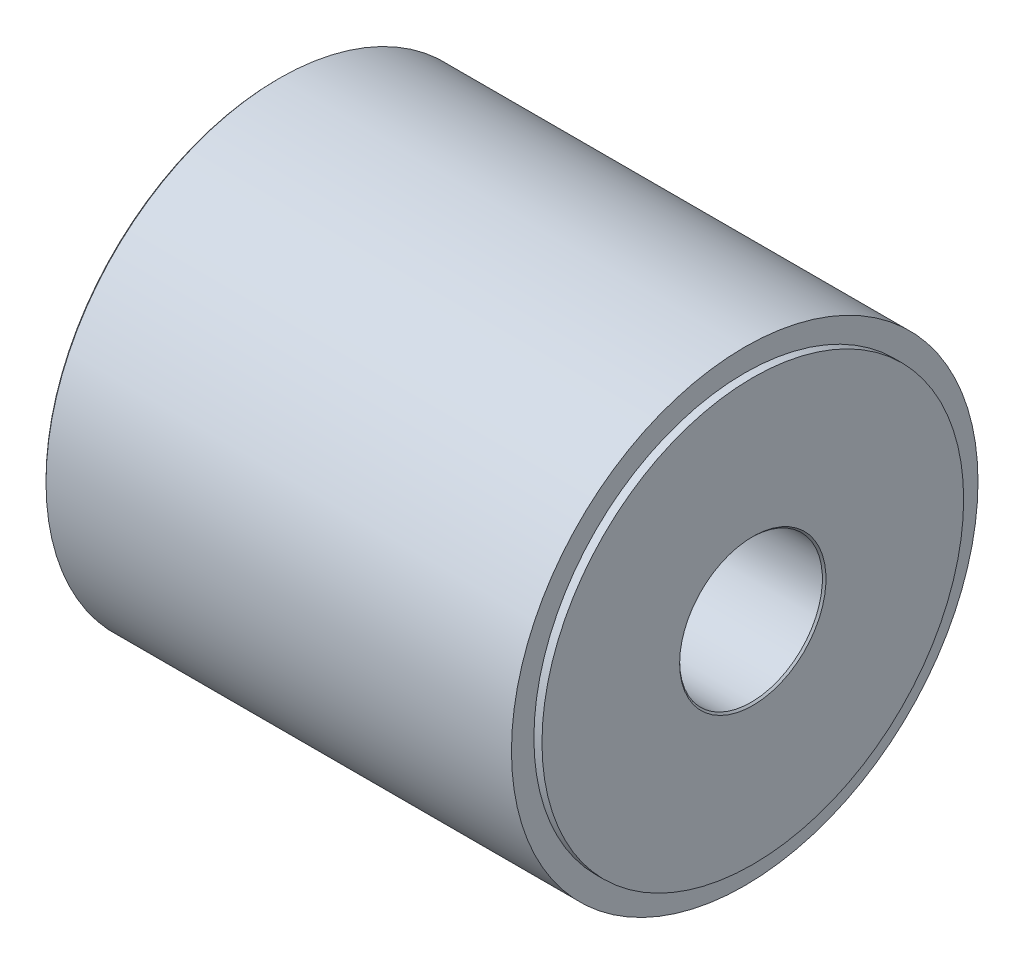
ISO-10303-21;
HEADER;
FILE_DESCRIPTION(('STEP AP214'),'2;1');
FILE_NAME('part.step','',(''),(''),'','','');
FILE_SCHEMA(('AUTOMOTIVE_DESIGN { 1 0 10303 214 1 1 1 1 }'));
ENDSEC;
DATA;
#1=APPLICATION_CONTEXT('core data for automotive mechanical design processes');
#2=APPLICATION_PROTOCOL_DEFINITION('international standard','automotive_design',2000,#1);
#3=PRODUCT_CONTEXT('',#1,'mechanical');
#4=PRODUCT('Part','Part','',(#3));
#5=PRODUCT_RELATED_PRODUCT_CATEGORY('part','',(#4));
#6=PRODUCT_DEFINITION_FORMATION('','',#4);
#7=PRODUCT_DEFINITION_CONTEXT('part definition',#1,'design');
#8=PRODUCT_DEFINITION('design','',#6,#7);
#9=PRODUCT_DEFINITION_SHAPE('','',#8);
#10=(LENGTH_UNIT() NAMED_UNIT(*) SI_UNIT(.MILLI.,.METRE.));
#11=(NAMED_UNIT(*) PLANE_ANGLE_UNIT() SI_UNIT($,.RADIAN.));
#12=(NAMED_UNIT(*) SI_UNIT($,.STERADIAN.) SOLID_ANGLE_UNIT());
#13=UNCERTAINTY_MEASURE_WITH_UNIT(LENGTH_MEASURE(1.E-05),#10,'distance_accuracy_value','');
#14=(GEOMETRIC_REPRESENTATION_CONTEXT(3) GLOBAL_UNCERTAINTY_ASSIGNED_CONTEXT((#13)) GLOBAL_UNIT_ASSIGNED_CONTEXT((#10,
#11,#12)) REPRESENTATION_CONTEXT('',''));
#15=CARTESIAN_POINT('',(0.,0.,0.));
#16=DIRECTION('',(0.,0.,1.));
#17=DIRECTION('',(1.,0.,0.));
#18=AXIS2_PLACEMENT_3D('',#15,#16,#17);
#19=CARTESIAN_POINT('',(0.,7.9565,0.));
#20=DIRECTION('',(1.,0.,0.));
#21=DIRECTION('',(0.,0.,-1.));
#22=AXIS2_PLACEMENT_3D('',#19,#20,#21);
#23=PLANE('',#22);
#24=CARTESIAN_POINT('',(0.,0.,0.));
#25=DIRECTION('',(1.,0.,0.));
#26=DIRECTION('',(0.,0.,-1.));
#27=AXIS2_PLACEMENT_3D('',#24,#25,#26);
#28=CIRCLE('',#27,23.3);
#29=CARTESIAN_POINT('',(0.,0.,-23.3));
#30=VERTEX_POINT('',#29);
#31=EDGE_CURVE('E54',#30,#30,#28,.F.);
#32=ORIENTED_EDGE('',*,*,#31,.T.);
#33=EDGE_LOOP('',(#32));
#34=FACE_BOUND('',#33,.T.);
#35=CARTESIAN_POINT('',(0.,0.,0.));
#36=DIRECTION('',(1.,0.,0.));
#37=DIRECTION('',(0.,0.,-1.));
#38=AXIS2_PLACEMENT_3D('',#35,#36,#37);
#39=CIRCLE('',#38,8.15650000000001);
#40=CARTESIAN_POINT('',(0.,0.,-8.15650000000001));
#41=VERTEX_POINT('',#40);
#42=EDGE_CURVE('E57',#41,#41,#39,.T.);
#43=ORIENTED_EDGE('',*,*,#42,.T.);
#44=EDGE_LOOP('',(#43));
#45=FACE_BOUND('',#44,.T.);
#46=ADVANCED_FACE('F34',(#34,#45),#23,.F.);
#47=CARTESIAN_POINT('',(0.,0.,0.));
#48=DIRECTION('',(-1.,0.,0.));
#49=DIRECTION('',(0.,0.,1.));
#50=AXIS2_PLACEMENT_3D('',#47,#48,#49);
#51=CYLINDRICAL_SURFACE('',#50,23.5);
#52=CARTESIAN_POINT('',(0.200000000000013,0.,0.));
#53=DIRECTION('',(1.,0.,0.));
#54=DIRECTION('',(0.,0.,-1.));
#55=AXIS2_PLACEMENT_3D('',#52,#53,#54);
#56=CIRCLE('',#55,23.5);
#57=CARTESIAN_POINT('',(0.200000000000013,0.,-23.5));
#58=VERTEX_POINT('',#57);
#59=EDGE_CURVE('E49',#58,#58,#56,.T.);
#60=ORIENTED_EDGE('',*,*,#59,.T.);
#61=EDGE_LOOP('',(#60));
#62=FACE_BOUND('',#61,.T.);
#63=CARTESIAN_POINT('',(1.,0.,0.));
#64=DIRECTION('',(-1.,0.,0.));
#65=DIRECTION('',(0.,0.,1.));
#66=AXIS2_PLACEMENT_3D('',#63,#64,#65);
#67=CIRCLE('',#66,23.5);
#68=CARTESIAN_POINT('',(1.,0.,23.5));
#69=VERTEX_POINT('',#68);
#70=EDGE_CURVE('E66',#69,#69,#67,.T.);
#71=ORIENTED_EDGE('',*,*,#70,.T.);
#72=EDGE_LOOP('',(#71));
#73=FACE_BOUND('',#72,.T.);
#74=ADVANCED_FACE('F96',(#62,#73),#51,.T.);
#75=CARTESIAN_POINT('',(1.,23.5,0.));
#76=DIRECTION('',(1.,0.,0.));
#77=DIRECTION('',(0.,0.,-1.));
#78=AXIS2_PLACEMENT_3D('',#75,#76,#77);
#79=PLANE('',#78);
#80=CARTESIAN_POINT('',(1.,0.,0.));
#81=DIRECTION('',(1.,0.,0.));
#82=DIRECTION('',(0.,0.,-1.));
#83=AXIS2_PLACEMENT_3D('',#80,#81,#82);
#84=CIRCLE('',#83,25.8);
#85=CARTESIAN_POINT('',(1.,0.,-25.8));
#86=VERTEX_POINT('',#85);
#87=EDGE_CURVE('E63',#86,#86,#84,.F.);
#88=ORIENTED_EDGE('',*,*,#87,.T.);
#89=EDGE_LOOP('',(#88));
#90=FACE_BOUND('',#89,.T.);
#91=ORIENTED_EDGE('',*,*,#70,.F.);
#92=EDGE_LOOP('',(#91));
#93=FACE_BOUND('',#92,.T.);
#94=ADVANCED_FACE('F102',(#90,#93),#79,.F.);
#95=CARTESIAN_POINT('',(0.,0.,0.));
#96=DIRECTION('',(-1.,0.,0.));
#97=DIRECTION('',(0.,0.,1.));
#98=AXIS2_PLACEMENT_3D('',#95,#96,#97);
#99=CYLINDRICAL_SURFACE('',#98,26.);
#100=CARTESIAN_POINT('',(1.20000000000001,0.,0.));
#101=DIRECTION('',(1.,0.,0.));
#102=DIRECTION('',(0.,0.,-1.));
#103=AXIS2_PLACEMENT_3D('',#100,#101,#102);
#104=CIRCLE('',#103,26.);
#105=CARTESIAN_POINT('',(1.20000000000001,0.,-26.));
#106=VERTEX_POINT('',#105);
#107=EDGE_CURVE('E60',#106,#106,#104,.T.);
#108=ORIENTED_EDGE('',*,*,#107,.T.);
#109=EDGE_LOOP('',(#108));
#110=FACE_BOUND('',#109,.T.);
#111=CARTESIAN_POINT('',(53.08,0.,0.));
#112=DIRECTION('',(-1.,0.,0.));
#113=DIRECTION('',(0.,0.,1.));
#114=AXIS2_PLACEMENT_3D('',#111,#112,#113);
#115=CIRCLE('',#114,26.);
#116=CARTESIAN_POINT('',(53.08,0.,26.));
#117=VERTEX_POINT('',#116);
#118=EDGE_CURVE('E69',#117,#117,#115,.T.);
#119=ORIENTED_EDGE('',*,*,#118,.T.);
#120=EDGE_LOOP('',(#119));
#121=FACE_BOUND('',#120,.T.);
#122=ADVANCED_FACE('F159',(#110,#121),#99,.T.);
#123=CARTESIAN_POINT('',(53.08,26.,0.));
#124=DIRECTION('',(-1.,0.,0.));
#125=DIRECTION('',(0.,0.,1.));
#126=AXIS2_PLACEMENT_3D('',#123,#124,#125);
#127=PLANE('',#126);
#128=ORIENTED_EDGE('',*,*,#118,.F.);
#129=EDGE_LOOP('',(#128));
#130=FACE_BOUND('',#129,.T.);
#131=CARTESIAN_POINT('',(53.08,0.,0.));
#132=DIRECTION('',(-1.,0.,0.));
#133=DIRECTION('',(0.,0.,1.));
#134=AXIS2_PLACEMENT_3D('',#131,#132,#133);
#135=CIRCLE('',#134,23.5);
#136=CARTESIAN_POINT('',(53.08,0.,23.5));
#137=VERTEX_POINT('',#136);
#138=EDGE_CURVE('E72',#137,#137,#135,.T.);
#139=ORIENTED_EDGE('',*,*,#138,.T.);
#140=EDGE_LOOP('',(#139));
#141=FACE_BOUND('',#140,.T.);
#142=ADVANCED_FACE('F92',(#130,#141),#127,.F.);
#143=CARTESIAN_POINT('',(0.,0.,0.));
#144=DIRECTION('',(-1.,0.,0.));
#145=DIRECTION('',(0.,0.,1.));
#146=AXIS2_PLACEMENT_3D('',#143,#144,#145);
#147=CYLINDRICAL_SURFACE('',#146,23.5);
#148=ORIENTED_EDGE('',*,*,#138,.F.);
#149=EDGE_LOOP('',(#148));
#150=FACE_BOUND('',#149,.T.);
#151=CARTESIAN_POINT('',(53.98,0.,0.));
#152=DIRECTION('',(-1.,0.,0.));
#153=DIRECTION('',(0.,0.,1.));
#154=AXIS2_PLACEMENT_3D('',#151,#152,#153);
#155=CIRCLE('',#154,23.5);
#156=CARTESIAN_POINT('',(53.98,0.,23.5));
#157=VERTEX_POINT('',#156);
#158=EDGE_CURVE('E75',#157,#157,#155,.T.);
#159=ORIENTED_EDGE('',*,*,#158,.T.);
#160=EDGE_LOOP('',(#159));
#161=FACE_BOUND('',#160,.T.);
#162=ADVANCED_FACE('F79',(#150,#161),#147,.T.);
#163=CARTESIAN_POINT('',(53.98,23.5,0.));
#164=DIRECTION('',(-1.,0.,0.));
#165=DIRECTION('',(0.,0.,1.));
#166=AXIS2_PLACEMENT_3D('',#163,#164,#165);
#167=PLANE('',#166);
#168=CARTESIAN_POINT('',(53.98,0.,0.));
#169=DIRECTION('',(-1.,0.,0.));
#170=DIRECTION('',(0.,0.,1.));
#171=AXIS2_PLACEMENT_3D('',#168,#169,#170);
#172=CIRCLE('',#171,8.1565);
#173=CARTESIAN_POINT('',(53.98,0.,8.1565));
#174=VERTEX_POINT('',#173);
#175=EDGE_CURVE('E45',#174,#174,#172,.T.);
#176=ORIENTED_EDGE('',*,*,#175,.T.);
#177=EDGE_LOOP('',(#176));
#178=FACE_BOUND('',#177,.T.);
#179=ORIENTED_EDGE('',*,*,#158,.F.);
#180=EDGE_LOOP('',(#179));
#181=FACE_BOUND('',#180,.T.);
#182=ADVANCED_FACE('F81',(#178,#181),#167,.F.);
#183=CARTESIAN_POINT('',(0.,0.,0.));
#184=DIRECTION('',(-1.,0.,0.));
#185=DIRECTION('',(0.,0.,1.));
#186=AXIS2_PLACEMENT_3D('',#183,#184,#185);
#187=CYLINDRICAL_SURFACE('',#186,7.9565);
#188=CARTESIAN_POINT('',(53.78,0.,0.));
#189=DIRECTION('',(-1.,0.,0.));
#190=DIRECTION('',(0.,0.,1.));
#191=AXIS2_PLACEMENT_3D('',#188,#189,#190);
#192=CIRCLE('',#191,7.9565);
#193=CARTESIAN_POINT('',(53.78,0.,7.9565));
#194=VERTEX_POINT('',#193);
#195=EDGE_CURVE('E10',#194,#194,#192,.F.);
#196=ORIENTED_EDGE('',*,*,#195,.T.);
#197=EDGE_LOOP('',(#196));
#198=FACE_BOUND('',#197,.T.);
#199=CARTESIAN_POINT('',(0.199999999999995,0.,0.));
#200=DIRECTION('',(1.,0.,0.));
#201=DIRECTION('',(0.,0.,-1.));
#202=AXIS2_PLACEMENT_3D('',#199,#200,#201);
#203=CIRCLE('',#202,7.9565);
#204=CARTESIAN_POINT('',(0.199999999999995,0.,-7.9565));
#205=VERTEX_POINT('',#204);
#206=EDGE_CURVE('E41',#205,#205,#203,.F.);
#207=ORIENTED_EDGE('',*,*,#206,.T.);
#208=EDGE_LOOP('',(#207));
#209=FACE_BOUND('',#208,.T.);
#210=ADVANCED_FACE('F83',(#198,#209),#187,.F.);
#211=CARTESIAN_POINT('',(1.,0.,0.));
#212=DIRECTION('',(1.,0.,0.));
#213=DIRECTION('',(0.,0.,-1.));
#214=AXIS2_PLACEMENT_3D('',#211,#212,#213);
#215=CONICAL_SURFACE('',#214,25.8,0.785398163397414);
#216=ORIENTED_EDGE('',*,*,#107,.F.);
#217=EDGE_LOOP('',(#216));
#218=FACE_BOUND('',#217,.T.);
#219=ORIENTED_EDGE('',*,*,#87,.F.);
#220=EDGE_LOOP('',(#219));
#221=FACE_BOUND('',#220,.T.);
#222=ADVANCED_FACE('F90',(#218,#221),#215,.T.);
#223=CARTESIAN_POINT('',(0.,0.,0.));
#224=DIRECTION('',(1.,0.,0.));
#225=DIRECTION('',(0.,0.,-1.));
#226=AXIS2_PLACEMENT_3D('',#223,#224,#225);
#227=CONICAL_SURFACE('',#226,23.3,0.78539816339744);
#228=ORIENTED_EDGE('',*,*,#59,.F.);
#229=EDGE_LOOP('',(#228));
#230=FACE_BOUND('',#229,.T.);
#231=ORIENTED_EDGE('',*,*,#31,.F.);
#232=EDGE_LOOP('',(#231));
#233=FACE_BOUND('',#232,.T.);
#234=ADVANCED_FACE('F110',(#230,#233),#227,.T.);
#235=CARTESIAN_POINT('',(53.98,0.,0.));
#236=DIRECTION('',(1.,0.,0.));
#237=DIRECTION('',(0.,0.,-1.));
#238=AXIS2_PLACEMENT_3D('',#235,#236,#237);
#239=CONICAL_SURFACE('',#238,8.1565,0.78539816339744);
#240=ORIENTED_EDGE('',*,*,#195,.F.);
#241=EDGE_LOOP('',(#240));
#242=FACE_BOUND('',#241,.T.);
#243=ORIENTED_EDGE('',*,*,#175,.F.);
#244=EDGE_LOOP('',(#243));
#245=FACE_BOUND('',#244,.T.);
#246=ADVANCED_FACE('F113',(#242,#245),#239,.F.);
#247=CARTESIAN_POINT('',(0.199999999999995,0.,0.));
#248=DIRECTION('',(-1.,0.,0.));
#249=DIRECTION('',(0.,0.,1.));
#250=AXIS2_PLACEMENT_3D('',#247,#248,#249);
#251=CONICAL_SURFACE('',#250,7.9565,0.785398163397483);
#252=ORIENTED_EDGE('',*,*,#42,.F.);
#253=EDGE_LOOP('',(#252));
#254=FACE_BOUND('',#253,.T.);
#255=ORIENTED_EDGE('',*,*,#206,.F.);
#256=EDGE_LOOP('',(#255));
#257=FACE_BOUND('',#256,.T.);
#258=ADVANCED_FACE('F36',(#254,#257),#251,.F.);
#259=CLOSED_SHELL('',(#46,#74,#94,#122,#142,#162,#182,#210,#222,#234,#246,#258));
#260=MANIFOLD_SOLID_BREP('B2',#259);
#261=ADVANCED_BREP_SHAPE_REPRESENTATION('',(#18,#260),#14);
#262=SHAPE_DEFINITION_REPRESENTATION(#9,#261);
ENDSEC;
END-ISO-10303-21;
